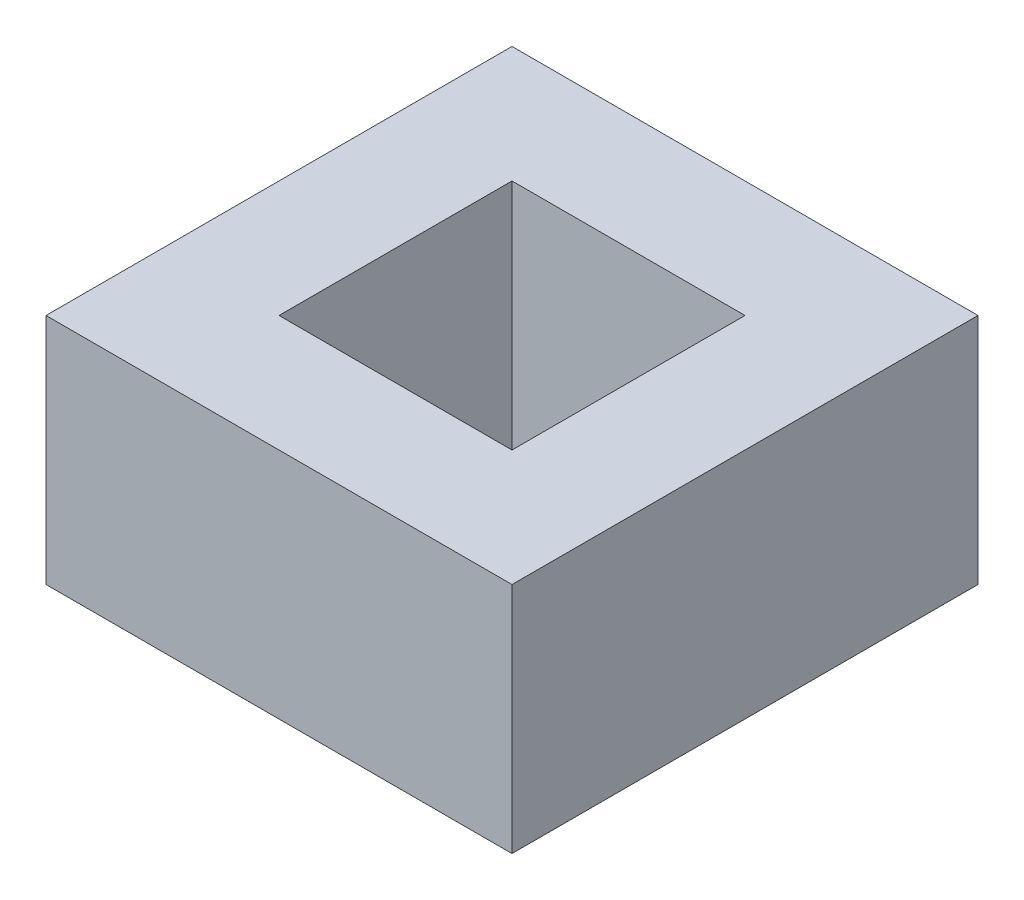
ISO-10303-21;
HEADER;
FILE_DESCRIPTION(('STEP AP214'),'2;1');
FILE_NAME('part.step','',(''),(''),'','','');
FILE_SCHEMA(('AUTOMOTIVE_DESIGN { 1 0 10303 214 1 1 1 1 }'));
ENDSEC;
DATA;
#1=APPLICATION_CONTEXT('core data for automotive mechanical design processes');
#2=APPLICATION_PROTOCOL_DEFINITION('international standard','automotive_design',2000,#1);
#3=PRODUCT_CONTEXT('',#1,'mechanical');
#4=PRODUCT('Part','Part','',(#3));
#5=PRODUCT_RELATED_PRODUCT_CATEGORY('part','',(#4));
#6=PRODUCT_DEFINITION_FORMATION('','',#4);
#7=PRODUCT_DEFINITION_CONTEXT('part definition',#1,'design');
#8=PRODUCT_DEFINITION('design','',#6,#7);
#9=PRODUCT_DEFINITION_SHAPE('','',#8);
#10=(LENGTH_UNIT() NAMED_UNIT(*) SI_UNIT(.MILLI.,.METRE.));
#11=(NAMED_UNIT(*) PLANE_ANGLE_UNIT() SI_UNIT($,.RADIAN.));
#12=(NAMED_UNIT(*) SI_UNIT($,.STERADIAN.) SOLID_ANGLE_UNIT());
#13=UNCERTAINTY_MEASURE_WITH_UNIT(LENGTH_MEASURE(1.E-05),#10,'distance_accuracy_value','');
#14=(GEOMETRIC_REPRESENTATION_CONTEXT(3) GLOBAL_UNCERTAINTY_ASSIGNED_CONTEXT((#13)) GLOBAL_UNIT_ASSIGNED_CONTEXT((#10,
#11,#12)) REPRESENTATION_CONTEXT('',''));
#15=CARTESIAN_POINT('',(0.,0.,0.));
#16=DIRECTION('',(0.,0.,1.));
#17=DIRECTION('',(1.,0.,0.));
#18=AXIS2_PLACEMENT_3D('',#15,#16,#17);
#19=CARTESIAN_POINT('',(0.,10.,0.));
#20=DIRECTION('',(0.,1.,0.));
#21=DIRECTION('',(0.,0.,1.));
#22=AXIS2_PLACEMENT_3D('',#19,#20,#21);
#23=PLANE('',#22);
#24=DIRECTION('',(0.,0.,-1.));
#25=VECTOR('',#24,1.);
#26=CARTESIAN_POINT('',(15.,10.,5.));
#27=LINE('',#26,#25);
#28=CARTESIAN_POINT('',(15.,10.,5.));
#29=VERTEX_POINT('',#28);
#30=CARTESIAN_POINT('',(15.,10.,-15.));
#31=VERTEX_POINT('',#30);
#32=EDGE_CURVE('E144',#29,#31,#27,.T.);
#33=ORIENTED_EDGE('',*,*,#32,.T.);
#34=DIRECTION('',(-1.,0.,0.));
#35=VECTOR('',#34,1.);
#36=CARTESIAN_POINT('',(15.,10.,-15.));
#37=LINE('',#36,#35);
#38=CARTESIAN_POINT('',(-5.,10.,-15.));
#39=VERTEX_POINT('',#38);
#40=EDGE_CURVE('E147',#31,#39,#37,.T.);
#41=ORIENTED_EDGE('',*,*,#40,.T.);
#42=DIRECTION('',(0.,0.,1.));
#43=VECTOR('',#42,1.);
#44=CARTESIAN_POINT('',(-5.,10.,-15.));
#45=LINE('',#44,#43);
#46=CARTESIAN_POINT('',(-5.,10.,5.));
#47=VERTEX_POINT('',#46);
#48=EDGE_CURVE('E150',#39,#47,#45,.T.);
#49=ORIENTED_EDGE('',*,*,#48,.T.);
#50=DIRECTION('',(1.,0.,0.));
#51=VECTOR('',#50,1.);
#52=CARTESIAN_POINT('',(-5.,10.,5.));
#53=LINE('',#52,#51);
#54=EDGE_CURVE('E152',#47,#29,#53,.T.);
#55=ORIENTED_EDGE('',*,*,#54,.T.);
#56=EDGE_LOOP('',(#33,#41,#49,#55));
#57=FACE_BOUND('',#56,.T.);
#58=DIRECTION('',(1.,0.,0.));
#59=VECTOR('',#58,1.);
#60=CARTESIAN_POINT('',(0.,10.,0.));
#61=LINE('',#60,#59);
#62=CARTESIAN_POINT('',(0.,10.,0.));
#63=VERTEX_POINT('',#62);
#64=CARTESIAN_POINT('',(10.,10.,0.));
#65=VERTEX_POINT('',#64);
#66=EDGE_CURVE('E116',#63,#65,#61,.T.);
#67=ORIENTED_EDGE('',*,*,#66,.F.);
#68=DIRECTION('',(0.,0.,1.));
#69=VECTOR('',#68,1.);
#70=CARTESIAN_POINT('',(0.,10.,-10.));
#71=LINE('',#70,#69);
#72=CARTESIAN_POINT('',(0.,10.,-10.));
#73=VERTEX_POINT('',#72);
#74=EDGE_CURVE('E108',#73,#63,#71,.T.);
#75=ORIENTED_EDGE('',*,*,#74,.F.);
#76=DIRECTION('',(-1.,0.,0.));
#77=VECTOR('',#76,1.);
#78=CARTESIAN_POINT('',(10.,10.,-10.));
#79=LINE('',#78,#77);
#80=CARTESIAN_POINT('',(10.,10.,-10.));
#81=VERTEX_POINT('',#80);
#82=EDGE_CURVE('E130',#81,#73,#79,.T.);
#83=ORIENTED_EDGE('',*,*,#82,.F.);
#84=DIRECTION('',(0.,0.,-1.));
#85=VECTOR('',#84,1.);
#86=CARTESIAN_POINT('',(10.,10.,0.));
#87=LINE('',#86,#85);
#88=EDGE_CURVE('E128',#65,#81,#87,.T.);
#89=ORIENTED_EDGE('',*,*,#88,.F.);
#90=EDGE_LOOP('',(#67,#75,#83,#89));
#91=FACE_BOUND('',#90,.T.);
#92=ADVANCED_FACE('F43',(#57,#91),#23,.T.);
#93=CARTESIAN_POINT('',(0.,0.,0.));
#94=DIRECTION('',(0.,1.,0.));
#95=DIRECTION('',(0.,0.,1.));
#96=AXIS2_PLACEMENT_3D('',#93,#94,#95);
#97=PLANE('',#96);
#98=DIRECTION('',(0.,0.,-1.));
#99=VECTOR('',#98,1.);
#100=CARTESIAN_POINT('',(15.,0.,5.));
#101=LINE('',#100,#99);
#102=CARTESIAN_POINT('',(15.,0.,5.));
#103=VERTEX_POINT('',#102);
#104=CARTESIAN_POINT('',(15.,0.,-15.));
#105=VERTEX_POINT('',#104);
#106=EDGE_CURVE('E124',#103,#105,#101,.T.);
#107=ORIENTED_EDGE('',*,*,#106,.F.);
#108=DIRECTION('',(1.,0.,0.));
#109=VECTOR('',#108,1.);
#110=CARTESIAN_POINT('',(-5.,0.,5.));
#111=LINE('',#110,#109);
#112=CARTESIAN_POINT('',(-5.,0.,5.));
#113=VERTEX_POINT('',#112);
#114=EDGE_CURVE('E148',#113,#103,#111,.T.);
#115=ORIENTED_EDGE('',*,*,#114,.F.);
#116=DIRECTION('',(0.,0.,1.));
#117=VECTOR('',#116,1.);
#118=CARTESIAN_POINT('',(-5.,0.,-15.));
#119=LINE('',#118,#117);
#120=CARTESIAN_POINT('',(-5.,0.,-15.));
#121=VERTEX_POINT('',#120);
#122=EDGE_CURVE('E159',#121,#113,#119,.T.);
#123=ORIENTED_EDGE('',*,*,#122,.F.);
#124=DIRECTION('',(-1.,0.,0.));
#125=VECTOR('',#124,1.);
#126=CARTESIAN_POINT('',(15.,0.,-15.));
#127=LINE('',#126,#125);
#128=EDGE_CURVE('E157',#105,#121,#127,.T.);
#129=ORIENTED_EDGE('',*,*,#128,.F.);
#130=EDGE_LOOP('',(#107,#115,#123,#129));
#131=FACE_BOUND('',#130,.T.);
#132=DIRECTION('',(0.,0.,1.));
#133=VECTOR('',#132,1.);
#134=CARTESIAN_POINT('',(0.,0.,-10.));
#135=LINE('',#134,#133);
#136=CARTESIAN_POINT('',(0.,0.,-10.));
#137=VERTEX_POINT('',#136);
#138=CARTESIAN_POINT('',(0.,0.,0.));
#139=VERTEX_POINT('',#138);
#140=EDGE_CURVE('E66',#137,#139,#135,.T.);
#141=ORIENTED_EDGE('',*,*,#140,.T.);
#142=DIRECTION('',(1.,0.,0.));
#143=VECTOR('',#142,1.);
#144=CARTESIAN_POINT('',(0.,0.,0.));
#145=LINE('',#144,#143);
#146=CARTESIAN_POINT('',(10.,0.,0.));
#147=VERTEX_POINT('',#146);
#148=EDGE_CURVE('E123',#139,#147,#145,.T.);
#149=ORIENTED_EDGE('',*,*,#148,.T.);
#150=DIRECTION('',(0.,0.,-1.));
#151=VECTOR('',#150,1.);
#152=CARTESIAN_POINT('',(10.,0.,0.));
#153=LINE('',#152,#151);
#154=CARTESIAN_POINT('',(10.,0.,-10.));
#155=VERTEX_POINT('',#154);
#156=EDGE_CURVE('E136',#147,#155,#153,.T.);
#157=ORIENTED_EDGE('',*,*,#156,.T.);
#158=DIRECTION('',(-1.,0.,0.));
#159=VECTOR('',#158,1.);
#160=CARTESIAN_POINT('',(10.,0.,-10.));
#161=LINE('',#160,#159);
#162=EDGE_CURVE('E117',#155,#137,#161,.T.);
#163=ORIENTED_EDGE('',*,*,#162,.T.);
#164=EDGE_LOOP('',(#141,#149,#157,#163));
#165=FACE_BOUND('',#164,.T.);
#166=ADVANCED_FACE('F177',(#131,#165),#97,.F.);
#167=CARTESIAN_POINT('',(15.,10.,5.));
#168=DIRECTION('',(-1.,0.,0.));
#169=DIRECTION('',(0.,0.,1.));
#170=AXIS2_PLACEMENT_3D('',#167,#168,#169);
#171=PLANE('',#170);
#172=ORIENTED_EDGE('',*,*,#106,.T.);
#173=DIRECTION('',(0.,-1.,0.));
#174=VECTOR('',#173,1.);
#175=CARTESIAN_POINT('',(15.,10.,-15.));
#176=LINE('',#175,#174);
#177=EDGE_CURVE('E11',#31,#105,#176,.T.);
#178=ORIENTED_EDGE('',*,*,#177,.F.);
#179=ORIENTED_EDGE('',*,*,#32,.F.);
#180=DIRECTION('',(0.,-1.,0.));
#181=VECTOR('',#180,1.);
#182=CARTESIAN_POINT('',(15.,10.,5.));
#183=LINE('',#182,#181);
#184=EDGE_CURVE('E154',#29,#103,#183,.T.);
#185=ORIENTED_EDGE('',*,*,#184,.T.);
#186=EDGE_LOOP('',(#172,#178,#179,#185));
#187=FACE_BOUND('',#186,.T.);
#188=ADVANCED_FACE('F45',(#187),#171,.F.);
#189=CARTESIAN_POINT('',(15.,10.,-15.));
#190=DIRECTION('',(0.,0.,1.));
#191=DIRECTION('',(1.,0.,0.));
#192=AXIS2_PLACEMENT_3D('',#189,#190,#191);
#193=PLANE('',#192);
#194=ORIENTED_EDGE('',*,*,#128,.T.);
#195=DIRECTION('',(0.,-1.,0.));
#196=VECTOR('',#195,1.);
#197=CARTESIAN_POINT('',(-5.,10.,-15.));
#198=LINE('',#197,#196);
#199=EDGE_CURVE('E51',#39,#121,#198,.T.);
#200=ORIENTED_EDGE('',*,*,#199,.F.);
#201=ORIENTED_EDGE('',*,*,#40,.F.);
#202=ORIENTED_EDGE('',*,*,#177,.T.);
#203=EDGE_LOOP('',(#194,#200,#201,#202));
#204=FACE_BOUND('',#203,.T.);
#205=ADVANCED_FACE('F187',(#204),#193,.F.);
#206=CARTESIAN_POINT('',(-5.,10.,-15.));
#207=DIRECTION('',(1.,0.,0.));
#208=DIRECTION('',(0.,0.,-1.));
#209=AXIS2_PLACEMENT_3D('',#206,#207,#208);
#210=PLANE('',#209);
#211=ORIENTED_EDGE('',*,*,#122,.T.);
#212=DIRECTION('',(0.,-1.,0.));
#213=VECTOR('',#212,1.);
#214=CARTESIAN_POINT('',(-5.,10.,5.));
#215=LINE('',#214,#213);
#216=EDGE_CURVE('E164',#47,#113,#215,.T.);
#217=ORIENTED_EDGE('',*,*,#216,.F.);
#218=ORIENTED_EDGE('',*,*,#48,.F.);
#219=ORIENTED_EDGE('',*,*,#199,.T.);
#220=EDGE_LOOP('',(#211,#217,#218,#219));
#221=FACE_BOUND('',#220,.T.);
#222=ADVANCED_FACE('F171',(#221),#210,.F.);
#223=CARTESIAN_POINT('',(-5.,10.,5.));
#224=DIRECTION('',(0.,0.,-1.));
#225=DIRECTION('',(-1.,0.,0.));
#226=AXIS2_PLACEMENT_3D('',#223,#224,#225);
#227=PLANE('',#226);
#228=ORIENTED_EDGE('',*,*,#114,.T.);
#229=ORIENTED_EDGE('',*,*,#184,.F.);
#230=ORIENTED_EDGE('',*,*,#54,.F.);
#231=ORIENTED_EDGE('',*,*,#216,.T.);
#232=EDGE_LOOP('',(#228,#229,#230,#231));
#233=FACE_BOUND('',#232,.T.);
#234=ADVANCED_FACE('F181',(#233),#227,.F.);
#235=CARTESIAN_POINT('',(0.,10.,-10.));
#236=DIRECTION('',(1.,0.,0.));
#237=DIRECTION('',(0.,0.,-1.));
#238=AXIS2_PLACEMENT_3D('',#235,#236,#237);
#239=PLANE('',#238);
#240=ORIENTED_EDGE('',*,*,#140,.F.);
#241=DIRECTION('',(0.,-1.,0.));
#242=VECTOR('',#241,1.);
#243=CARTESIAN_POINT('',(0.,10.,-10.));
#244=LINE('',#243,#242);
#245=EDGE_CURVE('E112',#73,#137,#244,.T.);
#246=ORIENTED_EDGE('',*,*,#245,.F.);
#247=ORIENTED_EDGE('',*,*,#74,.T.);
#248=DIRECTION('',(0.,-1.,0.));
#249=VECTOR('',#248,1.);
#250=CARTESIAN_POINT('',(0.,10.,0.));
#251=LINE('',#250,#249);
#252=EDGE_CURVE('E111',#63,#139,#251,.T.);
#253=ORIENTED_EDGE('',*,*,#252,.T.);
#254=EDGE_LOOP('',(#240,#246,#247,#253));
#255=FACE_BOUND('',#254,.T.);
#256=ADVANCED_FACE('F110',(#255),#239,.T.);
#257=CARTESIAN_POINT('',(0.,10.,0.));
#258=DIRECTION('',(0.,0.,-1.));
#259=DIRECTION('',(-1.,0.,0.));
#260=AXIS2_PLACEMENT_3D('',#257,#258,#259);
#261=PLANE('',#260);
#262=ORIENTED_EDGE('',*,*,#148,.F.);
#263=ORIENTED_EDGE('',*,*,#252,.F.);
#264=ORIENTED_EDGE('',*,*,#66,.T.);
#265=DIRECTION('',(0.,-1.,0.));
#266=VECTOR('',#265,1.);
#267=CARTESIAN_POINT('',(10.,10.,0.));
#268=LINE('',#267,#266);
#269=EDGE_CURVE('E125',#65,#147,#268,.T.);
#270=ORIENTED_EDGE('',*,*,#269,.T.);
#271=EDGE_LOOP('',(#262,#263,#264,#270));
#272=FACE_BOUND('',#271,.T.);
#273=ADVANCED_FACE('F120',(#272),#261,.T.);
#274=CARTESIAN_POINT('',(10.,10.,0.));
#275=DIRECTION('',(-1.,0.,0.));
#276=DIRECTION('',(0.,0.,1.));
#277=AXIS2_PLACEMENT_3D('',#274,#275,#276);
#278=PLANE('',#277);
#279=ORIENTED_EDGE('',*,*,#156,.F.);
#280=ORIENTED_EDGE('',*,*,#269,.F.);
#281=ORIENTED_EDGE('',*,*,#88,.T.);
#282=DIRECTION('',(0.,-1.,0.));
#283=VECTOR('',#282,1.);
#284=CARTESIAN_POINT('',(10.,10.,-10.));
#285=LINE('',#284,#283);
#286=EDGE_CURVE('E58',#81,#155,#285,.T.);
#287=ORIENTED_EDGE('',*,*,#286,.T.);
#288=EDGE_LOOP('',(#279,#280,#281,#287));
#289=FACE_BOUND('',#288,.T.);
#290=ADVANCED_FACE('F210',(#289),#278,.T.);
#291=CARTESIAN_POINT('',(10.,10.,-10.));
#292=DIRECTION('',(0.,0.,1.));
#293=DIRECTION('',(1.,0.,0.));
#294=AXIS2_PLACEMENT_3D('',#291,#292,#293);
#295=PLANE('',#294);
#296=ORIENTED_EDGE('',*,*,#162,.F.);
#297=ORIENTED_EDGE('',*,*,#286,.F.);
#298=ORIENTED_EDGE('',*,*,#82,.T.);
#299=ORIENTED_EDGE('',*,*,#245,.T.);
#300=EDGE_LOOP('',(#296,#297,#298,#299));
#301=FACE_BOUND('',#300,.T.);
#302=ADVANCED_FACE('F214',(#301),#295,.T.);
#303=CLOSED_SHELL('',(#92,#166,#188,#205,#222,#234,#256,#273,#290,#302));
#304=MANIFOLD_SOLID_BREP('B2',#303);
#305=ADVANCED_BREP_SHAPE_REPRESENTATION('',(#18,#304),#14);
#306=SHAPE_DEFINITION_REPRESENTATION(#9,#305);
ENDSEC;
END-ISO-10303-21;
